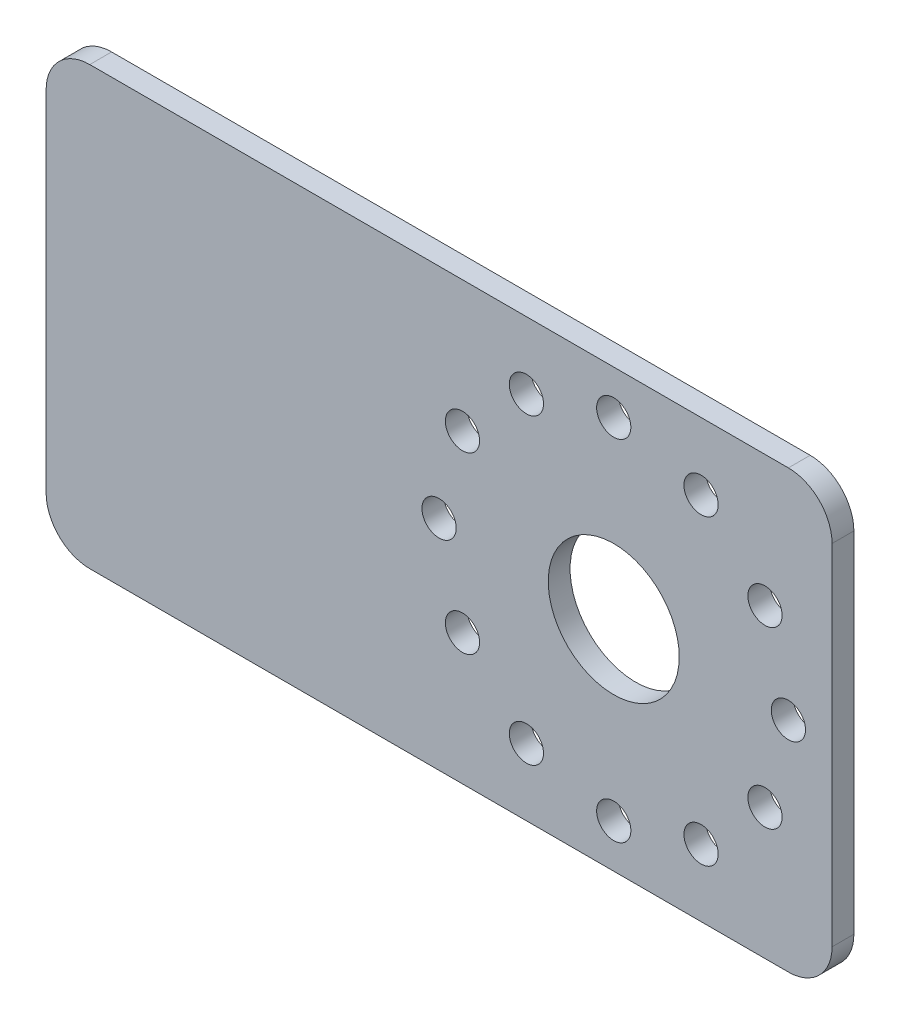
ISO-10303-21;
HEADER;
FILE_DESCRIPTION(('STEP AP214'),'2;1');
FILE_NAME('part.step','',(''),(''),'','','');
FILE_SCHEMA(('AUTOMOTIVE_DESIGN { 1 0 10303 214 1 1 1 1 }'));
ENDSEC;
DATA;
#1=APPLICATION_CONTEXT('core data for automotive mechanical design processes');
#2=APPLICATION_PROTOCOL_DEFINITION('international standard','automotive_design',2000,#1);
#3=PRODUCT_CONTEXT('',#1,'mechanical');
#4=PRODUCT('Part','Part','',(#3));
#5=PRODUCT_RELATED_PRODUCT_CATEGORY('part','',(#4));
#6=PRODUCT_DEFINITION_FORMATION('','',#4);
#7=PRODUCT_DEFINITION_CONTEXT('part definition',#1,'design');
#8=PRODUCT_DEFINITION('design','',#6,#7);
#9=PRODUCT_DEFINITION_SHAPE('','',#8);
#10=(LENGTH_UNIT() NAMED_UNIT(*) SI_UNIT(.MILLI.,.METRE.));
#11=(NAMED_UNIT(*) PLANE_ANGLE_UNIT() SI_UNIT($,.RADIAN.));
#12=(NAMED_UNIT(*) SI_UNIT($,.STERADIAN.) SOLID_ANGLE_UNIT());
#13=UNCERTAINTY_MEASURE_WITH_UNIT(LENGTH_MEASURE(1.E-05),#10,'distance_accuracy_value','');
#14=(GEOMETRIC_REPRESENTATION_CONTEXT(3) GLOBAL_UNCERTAINTY_ASSIGNED_CONTEXT((#13)) GLOBAL_UNIT_ASSIGNED_CONTEXT((#10,
#11,#12)) REPRESENTATION_CONTEXT('',''));
#15=CARTESIAN_POINT('',(0.,0.,0.));
#16=DIRECTION('',(0.,0.,1.));
#17=DIRECTION('',(1.,0.,0.));
#18=AXIS2_PLACEMENT_3D('',#15,#16,#17);
#19=CARTESIAN_POINT('',(95.2499999999999,227.076,3.175));
#20=DIRECTION('',(0.,0.,1.));
#21=DIRECTION('',(1.,0.,0.));
#22=AXIS2_PLACEMENT_3D('',#19,#20,#21);
#23=PLANE('',#22);
#24=CARTESIAN_POINT('',(149.452954743875,214.376,3.175));
#25=DIRECTION('',(0.,0.,1.));
#26=DIRECTION('',(1.,0.,0.));
#27=AXIS2_PLACEMENT_3D('',#24,#25,#26);
#28=CIRCLE('',#27,2.48920000000001);
#29=CARTESIAN_POINT('',(151.942154743875,214.376,3.175));
#30=VERTEX_POINT('',#29);
#31=EDGE_CURVE('E299',#30,#30,#28,.T.);
#32=ORIENTED_EDGE('',*,*,#31,.F.);
#33=EDGE_LOOP('',(#32));
#34=FACE_BOUND('',#33,.T.);
#35=CARTESIAN_POINT('',(158.75,223.673045256125,3.175));
#36=DIRECTION('',(0.,0.,1.));
#37=DIRECTION('',(1.,0.,0.));
#38=AXIS2_PLACEMENT_3D('',#35,#36,#37);
#39=CIRCLE('',#38,2.48920000000001);
#40=CARTESIAN_POINT('',(161.2392,223.673045256125,3.175));
#41=VERTEX_POINT('',#40);
#42=EDGE_CURVE('E283',#41,#41,#39,.T.);
#43=ORIENTED_EDGE('',*,*,#42,.F.);
#44=EDGE_LOOP('',(#43));
#45=FACE_BOUND('',#44,.T.);
#46=CARTESIAN_POINT('',(158.75,179.678954743875,3.175));
#47=DIRECTION('',(0.,0.,1.));
#48=DIRECTION('',(1.,0.,0.));
#49=AXIS2_PLACEMENT_3D('',#46,#47,#48);
#50=CIRCLE('',#49,2.48920000000001);
#51=CARTESIAN_POINT('',(161.2392,179.678954743875,3.175));
#52=VERTEX_POINT('',#51);
#53=EDGE_CURVE('E267',#52,#52,#50,.T.);
#54=ORIENTED_EDGE('',*,*,#53,.F.);
#55=EDGE_LOOP('',(#54));
#56=FACE_BOUND('',#55,.T.);
#57=CARTESIAN_POINT('',(184.15,179.678954743875,3.175));
#58=DIRECTION('',(0.,0.,1.));
#59=DIRECTION('',(1.,0.,0.));
#60=AXIS2_PLACEMENT_3D('',#57,#58,#59);
#61=CIRCLE('',#60,2.48919999999995);
#62=CARTESIAN_POINT('',(186.6392,179.678954743875,3.175));
#63=VERTEX_POINT('',#62);
#64=EDGE_CURVE('E251',#63,#63,#61,.T.);
#65=ORIENTED_EDGE('',*,*,#64,.F.);
#66=EDGE_LOOP('',(#65));
#67=FACE_BOUND('',#66,.T.);
#68=CARTESIAN_POINT('',(193.447045256125,188.976,3.175));
#69=DIRECTION('',(0.,0.,1.));
#70=DIRECTION('',(1.,0.,0.));
#71=AXIS2_PLACEMENT_3D('',#68,#69,#70);
#72=CIRCLE('',#71,2.48920000000001);
#73=CARTESIAN_POINT('',(195.936245256125,188.976,3.175));
#74=VERTEX_POINT('',#73);
#75=EDGE_CURVE('E235',#74,#74,#72,.T.);
#76=ORIENTED_EDGE('',*,*,#75,.F.);
#77=EDGE_LOOP('',(#76));
#78=FACE_BOUND('',#77,.T.);
#79=CARTESIAN_POINT('',(193.447045256125,214.376,3.175));
#80=DIRECTION('',(0.,0.,1.));
#81=DIRECTION('',(1.,0.,0.));
#82=AXIS2_PLACEMENT_3D('',#79,#80,#81);
#83=CIRCLE('',#82,2.48920000000001);
#84=CARTESIAN_POINT('',(195.936245256125,214.376,3.175));
#85=VERTEX_POINT('',#84);
#86=EDGE_CURVE('E219',#85,#85,#83,.T.);
#87=ORIENTED_EDGE('',*,*,#86,.F.);
#88=EDGE_LOOP('',(#87));
#89=FACE_BOUND('',#88,.T.);
#90=CARTESIAN_POINT('',(95.2499999999999,227.076,3.175));
#91=DIRECTION('',(0.,0.,1.));
#92=DIRECTION('',(1.,0.,0.));
#93=AXIS2_PLACEMENT_3D('',#90,#91,#92);
#94=CIRCLE('',#93,6.34999999999999);
#95=CARTESIAN_POINT('',(95.25,233.426,3.175));
#96=VERTEX_POINT('',#95);
#97=CARTESIAN_POINT('',(88.8999999999999,227.076,3.175));
#98=VERTEX_POINT('',#97);
#99=EDGE_CURVE('E170',#96,#98,#94,.T.);
#100=ORIENTED_EDGE('',*,*,#99,.T.);
#101=DIRECTION('',(0.,-1.,0.));
#102=VECTOR('',#101,1.);
#103=CARTESIAN_POINT('',(88.8999999999999,227.076,3.175));
#104=LINE('',#103,#102);
#105=CARTESIAN_POINT('',(88.8999999999999,176.276,3.175));
#106=VERTEX_POINT('',#105);
#107=EDGE_CURVE('E106',#98,#106,#104,.T.);
#108=ORIENTED_EDGE('',*,*,#107,.T.);
#109=CARTESIAN_POINT('',(95.2499999999999,176.276,3.175));
#110=DIRECTION('',(0.,0.,1.));
#111=DIRECTION('',(1.,0.,0.));
#112=AXIS2_PLACEMENT_3D('',#109,#110,#111);
#113=CIRCLE('',#112,6.34999999999999);
#114=CARTESIAN_POINT('',(95.25,169.926,3.175));
#115=VERTEX_POINT('',#114);
#116=EDGE_CURVE('E191',#106,#115,#113,.T.);
#117=ORIENTED_EDGE('',*,*,#116,.T.);
#118=DIRECTION('',(1.,0.,0.));
#119=VECTOR('',#118,1.);
#120=CARTESIAN_POINT('',(95.25,169.926,3.175));
#121=LINE('',#120,#119);
#122=CARTESIAN_POINT('',(196.85,169.926,3.175));
#123=VERTEX_POINT('',#122);
#124=EDGE_CURVE('E205',#115,#123,#121,.T.);
#125=ORIENTED_EDGE('',*,*,#124,.T.);
#126=CARTESIAN_POINT('',(196.85,176.276,3.175));
#127=DIRECTION('',(0.,0.,1.));
#128=DIRECTION('',(1.,0.,0.));
#129=AXIS2_PLACEMENT_3D('',#126,#127,#128);
#130=CIRCLE('',#129,6.34999999999999);
#131=CARTESIAN_POINT('',(203.2,176.276,3.175));
#132=VERTEX_POINT('',#131);
#133=EDGE_CURVE('E125',#123,#132,#130,.T.);
#134=ORIENTED_EDGE('',*,*,#133,.T.);
#135=DIRECTION('',(0.,1.,0.));
#136=VECTOR('',#135,1.);
#137=CARTESIAN_POINT('',(203.2,227.076,3.175));
#138=LINE('',#137,#136);
#139=CARTESIAN_POINT('',(203.2,227.076,3.175));
#140=VERTEX_POINT('',#139);
#141=EDGE_CURVE('E119',#132,#140,#138,.T.);
#142=ORIENTED_EDGE('',*,*,#141,.T.);
#143=CARTESIAN_POINT('',(196.85,227.076,3.175));
#144=DIRECTION('',(0.,0.,1.));
#145=DIRECTION('',(1.,0.,0.));
#146=AXIS2_PLACEMENT_3D('',#143,#144,#145);
#147=CIRCLE('',#146,6.34999999999999);
#148=CARTESIAN_POINT('',(196.85,233.426,3.175));
#149=VERTEX_POINT('',#148);
#150=EDGE_CURVE('E123',#140,#149,#147,.T.);
#151=ORIENTED_EDGE('',*,*,#150,.T.);
#152=DIRECTION('',(-1.,0.,0.));
#153=VECTOR('',#152,1.);
#154=CARTESIAN_POINT('',(95.25,233.426,3.175));
#155=LINE('',#154,#153);
#156=EDGE_CURVE('E63',#149,#96,#155,.T.);
#157=ORIENTED_EDGE('',*,*,#156,.T.);
#158=EDGE_LOOP('',(#100,#108,#117,#125,#134,#142,#151,#157));
#159=FACE_BOUND('',#158,.T.);
#160=CARTESIAN_POINT('',(184.15,223.673045256125,3.175));
#161=DIRECTION('',(0.,0.,1.));
#162=DIRECTION('',(1.,0.,0.));
#163=AXIS2_PLACEMENT_3D('',#160,#161,#162);
#164=CIRCLE('',#163,2.48920000000001);
#165=CARTESIAN_POINT('',(186.6392,223.673045256125,3.175));
#166=VERTEX_POINT('',#165);
#167=EDGE_CURVE('E152',#166,#166,#164,.T.);
#168=ORIENTED_EDGE('',*,*,#167,.F.);
#169=EDGE_LOOP('',(#168));
#170=FACE_BOUND('',#169,.T.);
#171=CARTESIAN_POINT('',(196.85,201.676,3.175));
#172=DIRECTION('',(0.,0.,1.));
#173=DIRECTION('',(1.,0.,0.));
#174=AXIS2_PLACEMENT_3D('',#171,#172,#173);
#175=CIRCLE('',#174,2.48920000000006);
#176=CARTESIAN_POINT('',(199.3392,201.676,3.175));
#177=VERTEX_POINT('',#176);
#178=EDGE_CURVE('E227',#177,#177,#175,.T.);
#179=ORIENTED_EDGE('',*,*,#178,.F.);
#180=EDGE_LOOP('',(#179));
#181=FACE_BOUND('',#180,.T.);
#182=CARTESIAN_POINT('',(171.45,176.276,3.175));
#183=DIRECTION('',(0.,0.,1.));
#184=DIRECTION('',(1.,0.,0.));
#185=AXIS2_PLACEMENT_3D('',#182,#183,#184);
#186=CIRCLE('',#185,2.48920000000001);
#187=CARTESIAN_POINT('',(173.9392,176.276,3.175));
#188=VERTEX_POINT('',#187);
#189=EDGE_CURVE('E243',#188,#188,#186,.T.);
#190=ORIENTED_EDGE('',*,*,#189,.F.);
#191=EDGE_LOOP('',(#190));
#192=FACE_BOUND('',#191,.T.);
#193=CARTESIAN_POINT('',(171.45,201.676,3.175));
#194=DIRECTION('',(0.,0.,1.));
#195=DIRECTION('',(1.,0.,0.));
#196=AXIS2_PLACEMENT_3D('',#193,#194,#195);
#197=CIRCLE('',#196,9.52499999999999);
#198=CARTESIAN_POINT('',(180.975,201.676,3.175));
#199=VERTEX_POINT('',#198);
#200=EDGE_CURVE('E259',#199,#199,#197,.T.);
#201=ORIENTED_EDGE('',*,*,#200,.F.);
#202=EDGE_LOOP('',(#201));
#203=FACE_BOUND('',#202,.T.);
#204=CARTESIAN_POINT('',(149.452954743875,188.976,3.175));
#205=DIRECTION('',(0.,0.,1.));
#206=DIRECTION('',(1.,0.,0.));
#207=AXIS2_PLACEMENT_3D('',#204,#205,#206);
#208=CIRCLE('',#207,2.48919999999997);
#209=CARTESIAN_POINT('',(151.942154743875,188.976,3.175));
#210=VERTEX_POINT('',#209);
#211=EDGE_CURVE('E275',#210,#210,#208,.T.);
#212=ORIENTED_EDGE('',*,*,#211,.F.);
#213=EDGE_LOOP('',(#212));
#214=FACE_BOUND('',#213,.T.);
#215=CARTESIAN_POINT('',(171.45,227.076,3.175));
#216=DIRECTION('',(0.,0.,1.));
#217=DIRECTION('',(1.,0.,0.));
#218=AXIS2_PLACEMENT_3D('',#215,#216,#217);
#219=CIRCLE('',#218,2.48920000000001);
#220=CARTESIAN_POINT('',(173.9392,227.076,3.175));
#221=VERTEX_POINT('',#220);
#222=EDGE_CURVE('E291',#221,#221,#219,.T.);
#223=ORIENTED_EDGE('',*,*,#222,.F.);
#224=EDGE_LOOP('',(#223));
#225=FACE_BOUND('',#224,.T.);
#226=CARTESIAN_POINT('',(146.05,201.676,3.175));
#227=DIRECTION('',(0.,0.,1.));
#228=DIRECTION('',(1.,0.,0.));
#229=AXIS2_PLACEMENT_3D('',#226,#227,#228);
#230=CIRCLE('',#229,2.48920000000001);
#231=CARTESIAN_POINT('',(148.5392,201.676,3.175));
#232=VERTEX_POINT('',#231);
#233=EDGE_CURVE('E307',#232,#232,#230,.T.);
#234=ORIENTED_EDGE('',*,*,#233,.F.);
#235=EDGE_LOOP('',(#234));
#236=FACE_BOUND('',#235,.T.);
#237=ADVANCED_FACE('F45',(#34,#45,#56,#67,#78,#89,#159,#170,#181,#192,#203,#214,#225,#236),#23,.T.);
#238=CARTESIAN_POINT('',(95.2499999999999,227.076,0.));
#239=DIRECTION('',(0.,0.,1.));
#240=DIRECTION('',(1.,0.,0.));
#241=AXIS2_PLACEMENT_3D('',#238,#239,#240);
#242=PLANE('',#241);
#243=CARTESIAN_POINT('',(95.2499999999999,227.076,0.));
#244=DIRECTION('',(0.,0.,1.));
#245=DIRECTION('',(1.,0.,0.));
#246=AXIS2_PLACEMENT_3D('',#243,#244,#245);
#247=CIRCLE('',#246,6.34999999999999);
#248=CARTESIAN_POINT('',(95.25,233.426,0.));
#249=VERTEX_POINT('',#248);
#250=CARTESIAN_POINT('',(88.8999999999999,227.076,0.));
#251=VERTEX_POINT('',#250);
#252=EDGE_CURVE('E147',#249,#251,#247,.T.);
#253=ORIENTED_EDGE('',*,*,#252,.F.);
#254=DIRECTION('',(-1.,0.,0.));
#255=VECTOR('',#254,1.);
#256=CARTESIAN_POINT('',(95.25,233.426,0.));
#257=LINE('',#256,#255);
#258=CARTESIAN_POINT('',(196.85,233.426,0.));
#259=VERTEX_POINT('',#258);
#260=EDGE_CURVE('E98',#259,#249,#257,.T.);
#261=ORIENTED_EDGE('',*,*,#260,.F.);
#262=CARTESIAN_POINT('',(196.85,227.076,0.));
#263=DIRECTION('',(0.,0.,1.));
#264=DIRECTION('',(1.,0.,0.));
#265=AXIS2_PLACEMENT_3D('',#262,#263,#264);
#266=CIRCLE('',#265,6.34999999999999);
#267=CARTESIAN_POINT('',(203.2,227.076,0.));
#268=VERTEX_POINT('',#267);
#269=EDGE_CURVE('E92',#268,#259,#266,.T.);
#270=ORIENTED_EDGE('',*,*,#269,.F.);
#271=DIRECTION('',(0.,1.,0.));
#272=VECTOR('',#271,1.);
#273=CARTESIAN_POINT('',(203.2,227.076,0.));
#274=LINE('',#273,#272);
#275=CARTESIAN_POINT('',(203.2,176.276,0.));
#276=VERTEX_POINT('',#275);
#277=EDGE_CURVE('E134',#276,#268,#274,.T.);
#278=ORIENTED_EDGE('',*,*,#277,.F.);
#279=CARTESIAN_POINT('',(196.85,176.276,0.));
#280=DIRECTION('',(0.,0.,1.));
#281=DIRECTION('',(1.,0.,0.));
#282=AXIS2_PLACEMENT_3D('',#279,#280,#281);
#283=CIRCLE('',#282,6.34999999999999);
#284=CARTESIAN_POINT('',(196.85,169.926,0.));
#285=VERTEX_POINT('',#284);
#286=EDGE_CURVE('E161',#285,#276,#283,.T.);
#287=ORIENTED_EDGE('',*,*,#286,.F.);
#288=DIRECTION('',(1.,0.,0.));
#289=VECTOR('',#288,1.);
#290=CARTESIAN_POINT('',(95.25,169.926,0.));
#291=LINE('',#290,#289);
#292=CARTESIAN_POINT('',(95.25,169.926,0.));
#293=VERTEX_POINT('',#292);
#294=EDGE_CURVE('E158',#293,#285,#291,.T.);
#295=ORIENTED_EDGE('',*,*,#294,.F.);
#296=CARTESIAN_POINT('',(95.2499999999999,176.276,0.));
#297=DIRECTION('',(0.,0.,1.));
#298=DIRECTION('',(1.,0.,0.));
#299=AXIS2_PLACEMENT_3D('',#296,#297,#298);
#300=CIRCLE('',#299,6.34999999999999);
#301=CARTESIAN_POINT('',(88.8999999999999,176.276,0.));
#302=VERTEX_POINT('',#301);
#303=EDGE_CURVE('E155',#302,#293,#300,.T.);
#304=ORIENTED_EDGE('',*,*,#303,.F.);
#305=DIRECTION('',(0.,-1.,0.));
#306=VECTOR('',#305,1.);
#307=CARTESIAN_POINT('',(88.8999999999999,227.076,0.));
#308=LINE('',#307,#306);
#309=EDGE_CURVE('E151',#251,#302,#308,.T.);
#310=ORIENTED_EDGE('',*,*,#309,.F.);
#311=EDGE_LOOP('',(#253,#261,#270,#278,#287,#295,#304,#310));
#312=FACE_BOUND('',#311,.T.);
#313=CARTESIAN_POINT('',(184.15,223.673045256125,0.));
#314=DIRECTION('',(0.,0.,1.));
#315=DIRECTION('',(1.,0.,0.));
#316=AXIS2_PLACEMENT_3D('',#313,#314,#315);
#317=CIRCLE('',#316,2.48920000000001);
#318=CARTESIAN_POINT('',(186.6392,223.673045256125,0.));
#319=VERTEX_POINT('',#318);
#320=EDGE_CURVE('E215',#319,#319,#317,.T.);
#321=ORIENTED_EDGE('',*,*,#320,.T.);
#322=EDGE_LOOP('',(#321));
#323=FACE_BOUND('',#322,.T.);
#324=CARTESIAN_POINT('',(193.447045256125,214.376,0.));
#325=DIRECTION('',(0.,0.,1.));
#326=DIRECTION('',(1.,0.,0.));
#327=AXIS2_PLACEMENT_3D('',#324,#325,#326);
#328=CIRCLE('',#327,2.48920000000001);
#329=CARTESIAN_POINT('',(195.936245256125,214.376,0.));
#330=VERTEX_POINT('',#329);
#331=EDGE_CURVE('E223',#330,#330,#328,.T.);
#332=ORIENTED_EDGE('',*,*,#331,.T.);
#333=EDGE_LOOP('',(#332));
#334=FACE_BOUND('',#333,.T.);
#335=CARTESIAN_POINT('',(196.85,201.676,0.));
#336=DIRECTION('',(0.,0.,1.));
#337=DIRECTION('',(1.,0.,0.));
#338=AXIS2_PLACEMENT_3D('',#335,#336,#337);
#339=CIRCLE('',#338,2.48920000000006);
#340=CARTESIAN_POINT('',(199.3392,201.676,0.));
#341=VERTEX_POINT('',#340);
#342=EDGE_CURVE('E231',#341,#341,#339,.T.);
#343=ORIENTED_EDGE('',*,*,#342,.T.);
#344=EDGE_LOOP('',(#343));
#345=FACE_BOUND('',#344,.T.);
#346=CARTESIAN_POINT('',(193.447045256125,188.976,0.));
#347=DIRECTION('',(0.,0.,1.));
#348=DIRECTION('',(1.,0.,0.));
#349=AXIS2_PLACEMENT_3D('',#346,#347,#348);
#350=CIRCLE('',#349,2.48920000000001);
#351=CARTESIAN_POINT('',(195.936245256125,188.976,0.));
#352=VERTEX_POINT('',#351);
#353=EDGE_CURVE('E239',#352,#352,#350,.T.);
#354=ORIENTED_EDGE('',*,*,#353,.T.);
#355=EDGE_LOOP('',(#354));
#356=FACE_BOUND('',#355,.T.);
#357=CARTESIAN_POINT('',(171.45,176.276,0.));
#358=DIRECTION('',(0.,0.,1.));
#359=DIRECTION('',(1.,0.,0.));
#360=AXIS2_PLACEMENT_3D('',#357,#358,#359);
#361=CIRCLE('',#360,2.48920000000001);
#362=CARTESIAN_POINT('',(173.9392,176.276,0.));
#363=VERTEX_POINT('',#362);
#364=EDGE_CURVE('E247',#363,#363,#361,.T.);
#365=ORIENTED_EDGE('',*,*,#364,.T.);
#366=EDGE_LOOP('',(#365));
#367=FACE_BOUND('',#366,.T.);
#368=CARTESIAN_POINT('',(184.15,179.678954743875,0.));
#369=DIRECTION('',(0.,0.,1.));
#370=DIRECTION('',(1.,0.,0.));
#371=AXIS2_PLACEMENT_3D('',#368,#369,#370);
#372=CIRCLE('',#371,2.48919999999995);
#373=CARTESIAN_POINT('',(186.6392,179.678954743875,0.));
#374=VERTEX_POINT('',#373);
#375=EDGE_CURVE('E255',#374,#374,#372,.T.);
#376=ORIENTED_EDGE('',*,*,#375,.T.);
#377=EDGE_LOOP('',(#376));
#378=FACE_BOUND('',#377,.T.);
#379=CARTESIAN_POINT('',(171.45,201.676,0.));
#380=DIRECTION('',(0.,0.,1.));
#381=DIRECTION('',(1.,0.,0.));
#382=AXIS2_PLACEMENT_3D('',#379,#380,#381);
#383=CIRCLE('',#382,9.52499999999999);
#384=CARTESIAN_POINT('',(180.975,201.676,0.));
#385=VERTEX_POINT('',#384);
#386=EDGE_CURVE('E263',#385,#385,#383,.T.);
#387=ORIENTED_EDGE('',*,*,#386,.T.);
#388=EDGE_LOOP('',(#387));
#389=FACE_BOUND('',#388,.T.);
#390=CARTESIAN_POINT('',(158.75,179.678954743875,0.));
#391=DIRECTION('',(0.,0.,1.));
#392=DIRECTION('',(1.,0.,0.));
#393=AXIS2_PLACEMENT_3D('',#390,#391,#392);
#394=CIRCLE('',#393,2.48920000000001);
#395=CARTESIAN_POINT('',(161.2392,179.678954743875,0.));
#396=VERTEX_POINT('',#395);
#397=EDGE_CURVE('E271',#396,#396,#394,.T.);
#398=ORIENTED_EDGE('',*,*,#397,.T.);
#399=EDGE_LOOP('',(#398));
#400=FACE_BOUND('',#399,.T.);
#401=CARTESIAN_POINT('',(149.452954743875,188.976,0.));
#402=DIRECTION('',(0.,0.,1.));
#403=DIRECTION('',(1.,0.,0.));
#404=AXIS2_PLACEMENT_3D('',#401,#402,#403);
#405=CIRCLE('',#404,2.48919999999997);
#406=CARTESIAN_POINT('',(151.942154743875,188.976,0.));
#407=VERTEX_POINT('',#406);
#408=EDGE_CURVE('E279',#407,#407,#405,.T.);
#409=ORIENTED_EDGE('',*,*,#408,.T.);
#410=EDGE_LOOP('',(#409));
#411=FACE_BOUND('',#410,.T.);
#412=CARTESIAN_POINT('',(158.75,223.673045256125,0.));
#413=DIRECTION('',(0.,0.,1.));
#414=DIRECTION('',(1.,0.,0.));
#415=AXIS2_PLACEMENT_3D('',#412,#413,#414);
#416=CIRCLE('',#415,2.48920000000001);
#417=CARTESIAN_POINT('',(161.2392,223.673045256125,0.));
#418=VERTEX_POINT('',#417);
#419=EDGE_CURVE('E287',#418,#418,#416,.T.);
#420=ORIENTED_EDGE('',*,*,#419,.T.);
#421=EDGE_LOOP('',(#420));
#422=FACE_BOUND('',#421,.T.);
#423=CARTESIAN_POINT('',(171.45,227.076,0.));
#424=DIRECTION('',(0.,0.,1.));
#425=DIRECTION('',(1.,0.,0.));
#426=AXIS2_PLACEMENT_3D('',#423,#424,#425);
#427=CIRCLE('',#426,2.48920000000001);
#428=CARTESIAN_POINT('',(173.9392,227.076,0.));
#429=VERTEX_POINT('',#428);
#430=EDGE_CURVE('E295',#429,#429,#427,.T.);
#431=ORIENTED_EDGE('',*,*,#430,.T.);
#432=EDGE_LOOP('',(#431));
#433=FACE_BOUND('',#432,.T.);
#434=CARTESIAN_POINT('',(149.452954743875,214.376,0.));
#435=DIRECTION('',(0.,0.,1.));
#436=DIRECTION('',(1.,0.,0.));
#437=AXIS2_PLACEMENT_3D('',#434,#435,#436);
#438=CIRCLE('',#437,2.48920000000001);
#439=CARTESIAN_POINT('',(151.942154743875,214.376,0.));
#440=VERTEX_POINT('',#439);
#441=EDGE_CURVE('E303',#440,#440,#438,.T.);
#442=ORIENTED_EDGE('',*,*,#441,.T.);
#443=EDGE_LOOP('',(#442));
#444=FACE_BOUND('',#443,.T.);
#445=CARTESIAN_POINT('',(146.05,201.676,0.));
#446=DIRECTION('',(0.,0.,1.));
#447=DIRECTION('',(1.,0.,0.));
#448=AXIS2_PLACEMENT_3D('',#445,#446,#447);
#449=CIRCLE('',#448,2.48920000000001);
#450=CARTESIAN_POINT('',(148.5392,201.676,0.));
#451=VERTEX_POINT('',#450);
#452=EDGE_CURVE('E311',#451,#451,#449,.T.);
#453=ORIENTED_EDGE('',*,*,#452,.T.);
#454=EDGE_LOOP('',(#453));
#455=FACE_BOUND('',#454,.T.);
#456=ADVANCED_FACE('F195',(#312,#323,#334,#345,#356,#367,#378,#389,#400,#411,#422,#433,#444,
#455),#242,.F.);
#457=CARTESIAN_POINT('',(95.2499999999999,227.076,3.175));
#458=DIRECTION('',(0.,0.,-1.));
#459=DIRECTION('',(-1.,0.,0.));
#460=AXIS2_PLACEMENT_3D('',#457,#458,#459);
#461=CYLINDRICAL_SURFACE('',#460,6.34999999999999);
#462=ORIENTED_EDGE('',*,*,#252,.T.);
#463=DIRECTION('',(0.,0.,-1.));
#464=VECTOR('',#463,1.);
#465=CARTESIAN_POINT('',(88.8999999999999,227.076,3.175));
#466=LINE('',#465,#464);
#467=EDGE_CURVE('E11',#98,#251,#466,.T.);
#468=ORIENTED_EDGE('',*,*,#467,.F.);
#469=ORIENTED_EDGE('',*,*,#99,.F.);
#470=DIRECTION('',(0.,0.,-1.));
#471=VECTOR('',#470,1.);
#472=CARTESIAN_POINT('',(95.25,233.426,3.175));
#473=LINE('',#472,#471);
#474=EDGE_CURVE('E143',#96,#249,#473,.T.);
#475=ORIENTED_EDGE('',*,*,#474,.T.);
#476=EDGE_LOOP('',(#462,#468,#469,#475));
#477=FACE_BOUND('',#476,.T.);
#478=ADVANCED_FACE('F47',(#477),#461,.T.);
#479=CARTESIAN_POINT('',(88.8999999999999,227.076,3.175));
#480=DIRECTION('',(1.,0.,0.));
#481=DIRECTION('',(0.,1.,0.));
#482=AXIS2_PLACEMENT_3D('',#479,#480,#481);
#483=PLANE('',#482);
#484=ORIENTED_EDGE('',*,*,#309,.T.);
#485=DIRECTION('',(0.,0.,-1.));
#486=VECTOR('',#485,1.);
#487=CARTESIAN_POINT('',(88.8999999999999,176.276,3.175));
#488=LINE('',#487,#486);
#489=EDGE_CURVE('E55',#106,#302,#488,.T.);
#490=ORIENTED_EDGE('',*,*,#489,.F.);
#491=ORIENTED_EDGE('',*,*,#107,.F.);
#492=ORIENTED_EDGE('',*,*,#467,.T.);
#493=EDGE_LOOP('',(#484,#490,#491,#492));
#494=FACE_BOUND('',#493,.T.);
#495=ADVANCED_FACE('F347',(#494),#483,.F.);
#496=CARTESIAN_POINT('',(95.2499999999999,176.276,3.175));
#497=DIRECTION('',(0.,0.,-1.));
#498=DIRECTION('',(-1.,0.,0.));
#499=AXIS2_PLACEMENT_3D('',#496,#497,#498);
#500=CYLINDRICAL_SURFACE('',#499,6.34999999999999);
#501=ORIENTED_EDGE('',*,*,#303,.T.);
#502=DIRECTION('',(0.,0.,-1.));
#503=VECTOR('',#502,1.);
#504=CARTESIAN_POINT('',(95.25,169.926,3.175));
#505=LINE('',#504,#503);
#506=EDGE_CURVE('E181',#115,#293,#505,.T.);
#507=ORIENTED_EDGE('',*,*,#506,.F.);
#508=ORIENTED_EDGE('',*,*,#116,.F.);
#509=ORIENTED_EDGE('',*,*,#489,.T.);
#510=EDGE_LOOP('',(#501,#507,#508,#509));
#511=FACE_BOUND('',#510,.T.);
#512=ADVANCED_FACE('F189',(#511),#500,.T.);
#513=CARTESIAN_POINT('',(95.25,169.926,3.175));
#514=DIRECTION('',(0.,1.,0.));
#515=DIRECTION('',(0.,0.,1.));
#516=AXIS2_PLACEMENT_3D('',#513,#514,#515);
#517=PLANE('',#516);
#518=ORIENTED_EDGE('',*,*,#294,.T.);
#519=DIRECTION('',(0.,0.,-1.));
#520=VECTOR('',#519,1.);
#521=CARTESIAN_POINT('',(196.85,169.926,3.175));
#522=LINE('',#521,#520);
#523=EDGE_CURVE('E177',#123,#285,#522,.T.);
#524=ORIENTED_EDGE('',*,*,#523,.F.);
#525=ORIENTED_EDGE('',*,*,#124,.F.);
#526=ORIENTED_EDGE('',*,*,#506,.T.);
#527=EDGE_LOOP('',(#518,#524,#525,#526));
#528=FACE_BOUND('',#527,.T.);
#529=ADVANCED_FACE('F200',(#528),#517,.F.);
#530=CARTESIAN_POINT('',(196.85,176.276,3.175));
#531=DIRECTION('',(0.,0.,-1.));
#532=DIRECTION('',(-1.,0.,0.));
#533=AXIS2_PLACEMENT_3D('',#530,#531,#532);
#534=CYLINDRICAL_SURFACE('',#533,6.34999999999999);
#535=ORIENTED_EDGE('',*,*,#286,.T.);
#536=DIRECTION('',(0.,0.,-1.));
#537=VECTOR('',#536,1.);
#538=CARTESIAN_POINT('',(203.2,176.276,3.175));
#539=LINE('',#538,#537);
#540=EDGE_CURVE('E136',#132,#276,#539,.T.);
#541=ORIENTED_EDGE('',*,*,#540,.F.);
#542=ORIENTED_EDGE('',*,*,#133,.F.);
#543=ORIENTED_EDGE('',*,*,#523,.T.);
#544=EDGE_LOOP('',(#535,#541,#542,#543));
#545=FACE_BOUND('',#544,.T.);
#546=ADVANCED_FACE('F203',(#545),#534,.T.);
#547=CARTESIAN_POINT('',(203.2,227.076,3.175));
#548=DIRECTION('',(-1.,0.,0.));
#549=DIRECTION('',(0.,0.,1.));
#550=AXIS2_PLACEMENT_3D('',#547,#548,#549);
#551=PLANE('',#550);
#552=ORIENTED_EDGE('',*,*,#277,.T.);
#553=DIRECTION('',(0.,0.,-1.));
#554=VECTOR('',#553,1.);
#555=CARTESIAN_POINT('',(203.2,227.076,3.175));
#556=LINE('',#555,#554);
#557=EDGE_CURVE('E131',#140,#268,#556,.T.);
#558=ORIENTED_EDGE('',*,*,#557,.F.);
#559=ORIENTED_EDGE('',*,*,#141,.F.);
#560=ORIENTED_EDGE('',*,*,#540,.T.);
#561=EDGE_LOOP('',(#552,#558,#559,#560));
#562=FACE_BOUND('',#561,.T.);
#563=ADVANCED_FACE('F132',(#562),#551,.F.);
#564=CARTESIAN_POINT('',(196.85,227.076,3.175));
#565=DIRECTION('',(0.,0.,-1.));
#566=DIRECTION('',(-1.,0.,0.));
#567=AXIS2_PLACEMENT_3D('',#564,#565,#566);
#568=CYLINDRICAL_SURFACE('',#567,6.34999999999999);
#569=ORIENTED_EDGE('',*,*,#269,.T.);
#570=DIRECTION('',(0.,0.,-1.));
#571=VECTOR('',#570,1.);
#572=CARTESIAN_POINT('',(196.85,233.426,3.175));
#573=LINE('',#572,#571);
#574=EDGE_CURVE('E137',#149,#259,#573,.T.);
#575=ORIENTED_EDGE('',*,*,#574,.F.);
#576=ORIENTED_EDGE('',*,*,#150,.F.);
#577=ORIENTED_EDGE('',*,*,#557,.T.);
#578=EDGE_LOOP('',(#569,#575,#576,#577));
#579=FACE_BOUND('',#578,.T.);
#580=ADVANCED_FACE('F139',(#579),#568,.T.);
#581=CARTESIAN_POINT('',(95.25,233.426,3.175));
#582=DIRECTION('',(0.,-1.,0.));
#583=DIRECTION('',(0.,0.,-1.));
#584=AXIS2_PLACEMENT_3D('',#581,#582,#583);
#585=PLANE('',#584);
#586=ORIENTED_EDGE('',*,*,#260,.T.);
#587=ORIENTED_EDGE('',*,*,#474,.F.);
#588=ORIENTED_EDGE('',*,*,#156,.F.);
#589=ORIENTED_EDGE('',*,*,#574,.T.);
#590=EDGE_LOOP('',(#586,#587,#588,#589));
#591=FACE_BOUND('',#590,.T.);
#592=ADVANCED_FACE('F335',(#591),#585,.F.);
#593=CARTESIAN_POINT('',(184.15,223.673045256125,3.175));
#594=DIRECTION('',(0.,0.,-1.));
#595=DIRECTION('',(-1.,0.,0.));
#596=AXIS2_PLACEMENT_3D('',#593,#594,#595);
#597=CYLINDRICAL_SURFACE('',#596,2.48920000000001);
#598=ORIENTED_EDGE('',*,*,#167,.T.);
#599=EDGE_LOOP('',(#598));
#600=FACE_BOUND('',#599,.T.);
#601=ORIENTED_EDGE('',*,*,#320,.F.);
#602=EDGE_LOOP('',(#601));
#603=FACE_BOUND('',#602,.T.);
#604=ADVANCED_FACE('F332',(#600,#603),#597,.F.);
#605=CARTESIAN_POINT('',(193.447045256125,214.376,3.175));
#606=DIRECTION('',(0.,0.,-1.));
#607=DIRECTION('',(-1.,0.,0.));
#608=AXIS2_PLACEMENT_3D('',#605,#606,#607);
#609=CYLINDRICAL_SURFACE('',#608,2.48920000000001);
#610=ORIENTED_EDGE('',*,*,#86,.T.);
#611=EDGE_LOOP('',(#610));
#612=FACE_BOUND('',#611,.T.);
#613=ORIENTED_EDGE('',*,*,#331,.F.);
#614=EDGE_LOOP('',(#613));
#615=FACE_BOUND('',#614,.T.);
#616=ADVANCED_FACE('F410',(#612,#615),#609,.F.);
#617=CARTESIAN_POINT('',(196.85,201.676,3.175));
#618=DIRECTION('',(0.,0.,-1.));
#619=DIRECTION('',(-1.,0.,0.));
#620=AXIS2_PLACEMENT_3D('',#617,#618,#619);
#621=CYLINDRICAL_SURFACE('',#620,2.48920000000006);
#622=ORIENTED_EDGE('',*,*,#178,.T.);
#623=EDGE_LOOP('',(#622));
#624=FACE_BOUND('',#623,.T.);
#625=ORIENTED_EDGE('',*,*,#342,.F.);
#626=EDGE_LOOP('',(#625));
#627=FACE_BOUND('',#626,.T.);
#628=ADVANCED_FACE('F418',(#624,#627),#621,.F.);
#629=CARTESIAN_POINT('',(193.447045256125,188.976,3.175));
#630=DIRECTION('',(0.,0.,-1.));
#631=DIRECTION('',(-1.,0.,0.));
#632=AXIS2_PLACEMENT_3D('',#629,#630,#631);
#633=CYLINDRICAL_SURFACE('',#632,2.48920000000001);
#634=ORIENTED_EDGE('',*,*,#75,.T.);
#635=EDGE_LOOP('',(#634));
#636=FACE_BOUND('',#635,.T.);
#637=ORIENTED_EDGE('',*,*,#353,.F.);
#638=EDGE_LOOP('',(#637));
#639=FACE_BOUND('',#638,.T.);
#640=ADVANCED_FACE('F426',(#636,#639),#633,.F.);
#641=CARTESIAN_POINT('',(171.45,176.276,3.175));
#642=DIRECTION('',(0.,0.,-1.));
#643=DIRECTION('',(-1.,0.,0.));
#644=AXIS2_PLACEMENT_3D('',#641,#642,#643);
#645=CYLINDRICAL_SURFACE('',#644,2.48920000000001);
#646=ORIENTED_EDGE('',*,*,#189,.T.);
#647=EDGE_LOOP('',(#646));
#648=FACE_BOUND('',#647,.T.);
#649=ORIENTED_EDGE('',*,*,#364,.F.);
#650=EDGE_LOOP('',(#649));
#651=FACE_BOUND('',#650,.T.);
#652=ADVANCED_FACE('F435',(#648,#651),#645,.F.);
#653=CARTESIAN_POINT('',(184.15,179.678954743875,3.175));
#654=DIRECTION('',(0.,0.,-1.));
#655=DIRECTION('',(-1.,0.,0.));
#656=AXIS2_PLACEMENT_3D('',#653,#654,#655);
#657=CYLINDRICAL_SURFACE('',#656,2.48919999999995);
#658=ORIENTED_EDGE('',*,*,#64,.T.);
#659=EDGE_LOOP('',(#658));
#660=FACE_BOUND('',#659,.T.);
#661=ORIENTED_EDGE('',*,*,#375,.F.);
#662=EDGE_LOOP('',(#661));
#663=FACE_BOUND('',#662,.T.);
#664=ADVANCED_FACE('F444',(#660,#663),#657,.F.);
#665=CARTESIAN_POINT('',(171.45,201.676,3.175));
#666=DIRECTION('',(0.,0.,-1.));
#667=DIRECTION('',(-1.,0.,0.));
#668=AXIS2_PLACEMENT_3D('',#665,#666,#667);
#669=CYLINDRICAL_SURFACE('',#668,9.52499999999999);
#670=ORIENTED_EDGE('',*,*,#200,.T.);
#671=EDGE_LOOP('',(#670));
#672=FACE_BOUND('',#671,.T.);
#673=ORIENTED_EDGE('',*,*,#386,.F.);
#674=EDGE_LOOP('',(#673));
#675=FACE_BOUND('',#674,.T.);
#676=ADVANCED_FACE('F453',(#672,#675),#669,.F.);
#677=CARTESIAN_POINT('',(158.75,179.678954743875,3.175));
#678=DIRECTION('',(0.,0.,-1.));
#679=DIRECTION('',(-1.,0.,0.));
#680=AXIS2_PLACEMENT_3D('',#677,#678,#679);
#681=CYLINDRICAL_SURFACE('',#680,2.48920000000001);
#682=ORIENTED_EDGE('',*,*,#53,.T.);
#683=EDGE_LOOP('',(#682));
#684=FACE_BOUND('',#683,.T.);
#685=ORIENTED_EDGE('',*,*,#397,.F.);
#686=EDGE_LOOP('',(#685));
#687=FACE_BOUND('',#686,.T.);
#688=ADVANCED_FACE('F462',(#684,#687),#681,.F.);
#689=CARTESIAN_POINT('',(149.452954743875,188.976,3.175));
#690=DIRECTION('',(0.,0.,-1.));
#691=DIRECTION('',(-1.,0.,0.));
#692=AXIS2_PLACEMENT_3D('',#689,#690,#691);
#693=CYLINDRICAL_SURFACE('',#692,2.48919999999997);
#694=ORIENTED_EDGE('',*,*,#211,.T.);
#695=EDGE_LOOP('',(#694));
#696=FACE_BOUND('',#695,.T.);
#697=ORIENTED_EDGE('',*,*,#408,.F.);
#698=EDGE_LOOP('',(#697));
#699=FACE_BOUND('',#698,.T.);
#700=ADVANCED_FACE('F471',(#696,#699),#693,.F.);
#701=CARTESIAN_POINT('',(158.75,223.673045256125,3.175));
#702=DIRECTION('',(0.,0.,-1.));
#703=DIRECTION('',(-1.,0.,0.));
#704=AXIS2_PLACEMENT_3D('',#701,#702,#703);
#705=CYLINDRICAL_SURFACE('',#704,2.48920000000001);
#706=ORIENTED_EDGE('',*,*,#42,.T.);
#707=EDGE_LOOP('',(#706));
#708=FACE_BOUND('',#707,.T.);
#709=ORIENTED_EDGE('',*,*,#419,.F.);
#710=EDGE_LOOP('',(#709));
#711=FACE_BOUND('',#710,.T.);
#712=ADVANCED_FACE('F480',(#708,#711),#705,.F.);
#713=CARTESIAN_POINT('',(171.45,227.076,3.175));
#714=DIRECTION('',(0.,0.,-1.));
#715=DIRECTION('',(-1.,0.,0.));
#716=AXIS2_PLACEMENT_3D('',#713,#714,#715);
#717=CYLINDRICAL_SURFACE('',#716,2.48920000000001);
#718=ORIENTED_EDGE('',*,*,#222,.T.);
#719=EDGE_LOOP('',(#718));
#720=FACE_BOUND('',#719,.T.);
#721=ORIENTED_EDGE('',*,*,#430,.F.);
#722=EDGE_LOOP('',(#721));
#723=FACE_BOUND('',#722,.T.);
#724=ADVANCED_FACE('F489',(#720,#723),#717,.F.);
#725=CARTESIAN_POINT('',(149.452954743875,214.376,3.175));
#726=DIRECTION('',(0.,0.,-1.));
#727=DIRECTION('',(-1.,0.,0.));
#728=AXIS2_PLACEMENT_3D('',#725,#726,#727);
#729=CYLINDRICAL_SURFACE('',#728,2.48920000000001);
#730=ORIENTED_EDGE('',*,*,#31,.T.);
#731=EDGE_LOOP('',(#730));
#732=FACE_BOUND('',#731,.T.);
#733=ORIENTED_EDGE('',*,*,#441,.F.);
#734=EDGE_LOOP('',(#733));
#735=FACE_BOUND('',#734,.T.);
#736=ADVANCED_FACE('F498',(#732,#735),#729,.F.);
#737=CARTESIAN_POINT('',(146.05,201.676,3.175));
#738=DIRECTION('',(0.,0.,-1.));
#739=DIRECTION('',(-1.,0.,0.));
#740=AXIS2_PLACEMENT_3D('',#737,#738,#739);
#741=CYLINDRICAL_SURFACE('',#740,2.48920000000001);
#742=ORIENTED_EDGE('',*,*,#233,.T.);
#743=EDGE_LOOP('',(#742));
#744=FACE_BOUND('',#743,.T.);
#745=ORIENTED_EDGE('',*,*,#452,.F.);
#746=EDGE_LOOP('',(#745));
#747=FACE_BOUND('',#746,.T.);
#748=ADVANCED_FACE('F319',(#744,#747),#741,.F.);
#749=CLOSED_SHELL('',(#237,#456,#478,#495,#512,#529,#546,#563,#580,#592,#604,#616,#628,#640,
#652,#664,#676,#688,#700,#712,#724,#736,#748));
#750=MANIFOLD_SOLID_BREP('B2',#749);
#751=ADVANCED_BREP_SHAPE_REPRESENTATION('',(#18,#750),#14);
#752=SHAPE_DEFINITION_REPRESENTATION(#9,#751);
ENDSEC;
END-ISO-10303-21;
